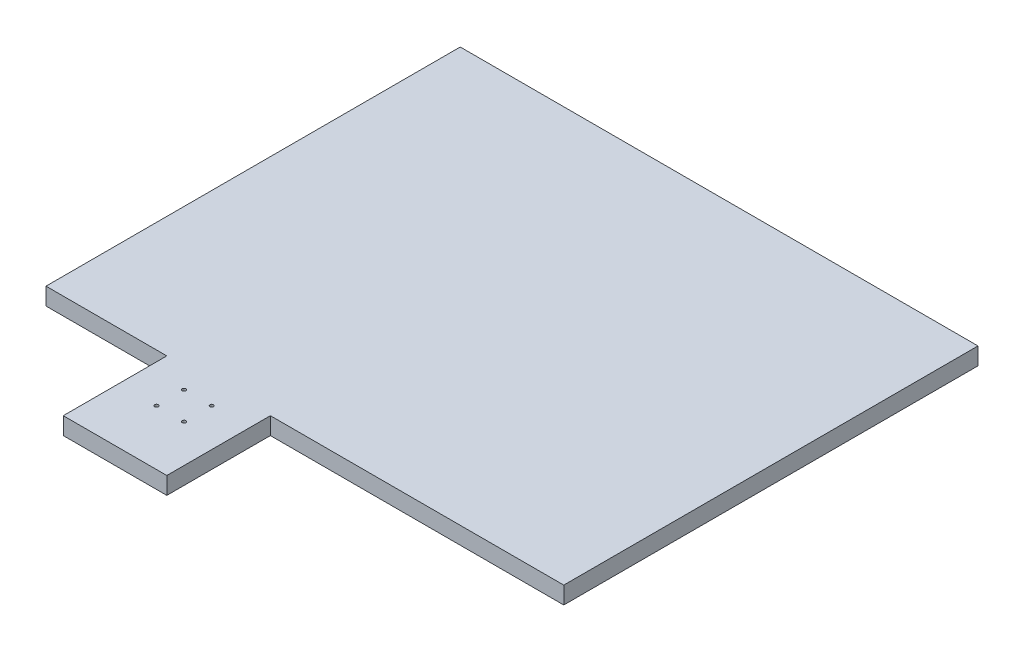
ISO-10303-21;
HEADER;
FILE_DESCRIPTION(('STEP AP214'),'2;1');
FILE_NAME('part.step','',(''),(''),'','','');
FILE_SCHEMA(('AUTOMOTIVE_DESIGN { 1 0 10303 214 1 1 1 1 }'));
ENDSEC;
DATA;
#1=APPLICATION_CONTEXT('core data for automotive mechanical design processes');
#2=APPLICATION_PROTOCOL_DEFINITION('international standard','automotive_design',2000,#1);
#3=PRODUCT_CONTEXT('',#1,'mechanical');
#4=PRODUCT('Part','Part','',(#3));
#5=PRODUCT_RELATED_PRODUCT_CATEGORY('part','',(#4));
#6=PRODUCT_DEFINITION_FORMATION('','',#4);
#7=PRODUCT_DEFINITION_CONTEXT('part definition',#1,'design');
#8=PRODUCT_DEFINITION('design','',#6,#7);
#9=PRODUCT_DEFINITION_SHAPE('','',#8);
#10=(LENGTH_UNIT() NAMED_UNIT(*) SI_UNIT(.MILLI.,.METRE.));
#11=(NAMED_UNIT(*) PLANE_ANGLE_UNIT() SI_UNIT($,.RADIAN.));
#12=(NAMED_UNIT(*) SI_UNIT($,.STERADIAN.) SOLID_ANGLE_UNIT());
#13=UNCERTAINTY_MEASURE_WITH_UNIT(LENGTH_MEASURE(1.E-05),#10,'distance_accuracy_value','');
#14=(GEOMETRIC_REPRESENTATION_CONTEXT(3) GLOBAL_UNCERTAINTY_ASSIGNED_CONTEXT((#13)) GLOBAL_UNIT_ASSIGNED_CONTEXT((#10,
#11,#12)) REPRESENTATION_CONTEXT('',''));
#15=CARTESIAN_POINT('',(0.,0.,0.));
#16=DIRECTION('',(0.,0.,1.));
#17=DIRECTION('',(1.,0.,0.));
#18=AXIS2_PLACEMENT_3D('',#15,#16,#17);
#19=CARTESIAN_POINT('',(0.,10.,0.));
#20=DIRECTION('',(0.,-1.,0.));
#21=DIRECTION('',(0.,0.,-1.));
#22=AXIS2_PLACEMENT_3D('',#19,#20,#21);
#23=PLANE('',#22);
#24=CARTESIAN_POINT('',(-58.,10.,132.));
#25=DIRECTION('',(0.,-1.,0.));
#26=DIRECTION('',(0.,0.,-1.));
#27=AXIS2_PLACEMENT_3D('',#24,#25,#26);
#28=CIRCLE('',#27,1.04999999999999);
#29=CARTESIAN_POINT('',(-58.,10.,130.95));
#30=VERTEX_POINT('',#29);
#31=EDGE_CURVE('E285',#30,#30,#28,.T.);
#32=ORIENTED_EDGE('',*,*,#31,.T.);
#33=EDGE_LOOP('',(#32));
#34=FACE_BOUND('',#33,.T.);
#35=CARTESIAN_POINT('',(-41.9999999999997,10.,132.));
#36=DIRECTION('',(0.,-1.,0.));
#37=DIRECTION('',(0.,0.,-1.));
#38=AXIS2_PLACEMENT_3D('',#35,#36,#37);
#39=CIRCLE('',#38,1.04999999999999);
#40=CARTESIAN_POINT('',(-41.9999999999997,10.,130.95));
#41=VERTEX_POINT('',#40);
#42=EDGE_CURVE('E281',#41,#41,#39,.F.);
#43=ORIENTED_EDGE('',*,*,#42,.F.);
#44=EDGE_LOOP('',(#43));
#45=FACE_BOUND('',#44,.T.);
#46=DIRECTION('',(0.,0.,-1.));
#47=VECTOR('',#46,1.);
#48=CARTESIAN_POINT('',(150.,10.,120.));
#49=LINE('',#48,#47);
#50=CARTESIAN_POINT('',(150.,10.,120.));
#51=VERTEX_POINT('',#50);
#52=CARTESIAN_POINT('',(150.,10.,-120.));
#53=VERTEX_POINT('',#52);
#54=EDGE_CURVE('E177',#51,#53,#49,.T.);
#55=ORIENTED_EDGE('',*,*,#54,.T.);
#56=DIRECTION('',(-1.,0.,0.));
#57=VECTOR('',#56,1.);
#58=CARTESIAN_POINT('',(-150.,10.,-120.));
#59=LINE('',#58,#57);
#60=CARTESIAN_POINT('',(-150.,10.,-120.));
#61=VERTEX_POINT('',#60);
#62=EDGE_CURVE('E105',#53,#61,#59,.T.);
#63=ORIENTED_EDGE('',*,*,#62,.T.);
#64=DIRECTION('',(0.,0.,1.));
#65=VECTOR('',#64,1.);
#66=CARTESIAN_POINT('',(-150.,10.,120.));
#67=LINE('',#66,#65);
#68=CARTESIAN_POINT('',(-150.,10.,120.));
#69=VERTEX_POINT('',#68);
#70=EDGE_CURVE('E198',#61,#69,#67,.T.);
#71=ORIENTED_EDGE('',*,*,#70,.T.);
#72=DIRECTION('',(1.,0.,0.));
#73=VECTOR('',#72,1.);
#74=CARTESIAN_POINT('',(-150.,10.,120.));
#75=LINE('',#74,#73);
#76=CARTESIAN_POINT('',(-80.,10.,120.));
#77=VERTEX_POINT('',#76);
#78=EDGE_CURVE('E212',#69,#77,#75,.T.);
#79=ORIENTED_EDGE('',*,*,#78,.T.);
#80=DIRECTION('',(0.,0.,1.));
#81=VECTOR('',#80,1.);
#82=CARTESIAN_POINT('',(-80.,10.,120.));
#83=LINE('',#82,#81);
#84=CARTESIAN_POINT('',(-80.,10.,180.));
#85=VERTEX_POINT('',#84);
#86=EDGE_CURVE('E128',#77,#85,#83,.T.);
#87=ORIENTED_EDGE('',*,*,#86,.T.);
#88=DIRECTION('',(1.,0.,0.));
#89=VECTOR('',#88,1.);
#90=CARTESIAN_POINT('',(-80.,10.,180.));
#91=LINE('',#90,#89);
#92=CARTESIAN_POINT('',(-20.,10.,180.));
#93=VERTEX_POINT('',#92);
#94=EDGE_CURVE('E121',#85,#93,#91,.T.);
#95=ORIENTED_EDGE('',*,*,#94,.T.);
#96=DIRECTION('',(0.,0.,-1.));
#97=VECTOR('',#96,1.);
#98=CARTESIAN_POINT('',(-20.,10.,180.));
#99=LINE('',#98,#97);
#100=CARTESIAN_POINT('',(-20.,10.,120.));
#101=VERTEX_POINT('',#100);
#102=EDGE_CURVE('E125',#93,#101,#99,.T.);
#103=ORIENTED_EDGE('',*,*,#102,.T.);
#104=DIRECTION('',(1.,0.,0.));
#105=VECTOR('',#104,1.);
#106=CARTESIAN_POINT('',(-20.,10.,120.));
#107=LINE('',#106,#105);
#108=EDGE_CURVE('E64',#101,#51,#107,.T.);
#109=ORIENTED_EDGE('',*,*,#108,.T.);
#110=EDGE_LOOP('',(#55,#63,#71,#79,#87,#95,#103,#109));
#111=FACE_BOUND('',#110,.T.);
#112=CARTESIAN_POINT('',(-58.,10.,148.));
#113=DIRECTION('',(0.,-1.,0.));
#114=DIRECTION('',(0.,0.,-1.));
#115=AXIS2_PLACEMENT_3D('',#112,#113,#114);
#116=CIRCLE('',#115,1.04999999999999);
#117=CARTESIAN_POINT('',(-58.,10.,146.95));
#118=VERTEX_POINT('',#117);
#119=EDGE_CURVE('E290',#118,#118,#116,.F.);
#120=ORIENTED_EDGE('',*,*,#119,.F.);
#121=EDGE_LOOP('',(#120));
#122=FACE_BOUND('',#121,.T.);
#123=CARTESIAN_POINT('',(-41.9999999999998,10.,148.));
#124=DIRECTION('',(0.,-1.,0.));
#125=DIRECTION('',(0.,0.,-1.));
#126=AXIS2_PLACEMENT_3D('',#123,#124,#125);
#127=CIRCLE('',#126,1.04999999999999);
#128=CARTESIAN_POINT('',(-41.9999999999998,10.,146.95));
#129=VERTEX_POINT('',#128);
#130=EDGE_CURVE('E286',#129,#129,#127,.T.);
#131=ORIENTED_EDGE('',*,*,#130,.T.);
#132=EDGE_LOOP('',(#131));
#133=FACE_BOUND('',#132,.T.);
#134=ADVANCED_FACE('F39',(#34,#45,#111,#122,#133),#23,.F.);
#135=CARTESIAN_POINT('',(0.,0.,0.));
#136=DIRECTION('',(0.,-1.,0.));
#137=DIRECTION('',(0.,0.,-1.));
#138=AXIS2_PLACEMENT_3D('',#135,#136,#137);
#139=PLANE('',#138);
#140=DIRECTION('',(0.,0.,-1.));
#141=VECTOR('',#140,1.);
#142=CARTESIAN_POINT('',(150.,0.,120.));
#143=LINE('',#142,#141);
#144=CARTESIAN_POINT('',(150.,0.,120.));
#145=VERTEX_POINT('',#144);
#146=CARTESIAN_POINT('',(150.,0.,-120.));
#147=VERTEX_POINT('',#146);
#148=EDGE_CURVE('E153',#145,#147,#143,.T.);
#149=ORIENTED_EDGE('',*,*,#148,.F.);
#150=DIRECTION('',(1.,0.,0.));
#151=VECTOR('',#150,1.);
#152=CARTESIAN_POINT('',(-20.,0.,120.));
#153=LINE('',#152,#151);
#154=CARTESIAN_POINT('',(-20.,0.,120.));
#155=VERTEX_POINT('',#154);
#156=EDGE_CURVE('E97',#155,#145,#153,.T.);
#157=ORIENTED_EDGE('',*,*,#156,.F.);
#158=DIRECTION('',(0.,0.,-1.));
#159=VECTOR('',#158,1.);
#160=CARTESIAN_POINT('',(-20.,0.,180.));
#161=LINE('',#160,#159);
#162=CARTESIAN_POINT('',(-20.,0.,180.));
#163=VERTEX_POINT('',#162);
#164=EDGE_CURVE('E172',#163,#155,#161,.T.);
#165=ORIENTED_EDGE('',*,*,#164,.F.);
#166=DIRECTION('',(1.,0.,0.));
#167=VECTOR('',#166,1.);
#168=CARTESIAN_POINT('',(-80.,0.,180.));
#169=LINE('',#168,#167);
#170=CARTESIAN_POINT('',(-80.,0.,180.));
#171=VERTEX_POINT('',#170);
#172=EDGE_CURVE('E138',#171,#163,#169,.T.);
#173=ORIENTED_EDGE('',*,*,#172,.F.);
#174=DIRECTION('',(0.,0.,1.));
#175=VECTOR('',#174,1.);
#176=CARTESIAN_POINT('',(-80.,0.,120.));
#177=LINE('',#176,#175);
#178=CARTESIAN_POINT('',(-80.,0.,120.));
#179=VERTEX_POINT('',#178);
#180=EDGE_CURVE('E167',#179,#171,#177,.T.);
#181=ORIENTED_EDGE('',*,*,#180,.F.);
#182=DIRECTION('',(1.,0.,0.));
#183=VECTOR('',#182,1.);
#184=CARTESIAN_POINT('',(-150.,0.,120.));
#185=LINE('',#184,#183);
#186=CARTESIAN_POINT('',(-150.,0.,120.));
#187=VERTEX_POINT('',#186);
#188=EDGE_CURVE('E164',#187,#179,#185,.T.);
#189=ORIENTED_EDGE('',*,*,#188,.F.);
#190=DIRECTION('',(0.,0.,1.));
#191=VECTOR('',#190,1.);
#192=CARTESIAN_POINT('',(-150.,0.,120.));
#193=LINE('',#192,#191);
#194=CARTESIAN_POINT('',(-150.,0.,-120.));
#195=VERTEX_POINT('',#194);
#196=EDGE_CURVE('E161',#195,#187,#193,.T.);
#197=ORIENTED_EDGE('',*,*,#196,.F.);
#198=DIRECTION('',(-1.,0.,0.));
#199=VECTOR('',#198,1.);
#200=CARTESIAN_POINT('',(-150.,0.,-120.));
#201=LINE('',#200,#199);
#202=EDGE_CURVE('E157',#147,#195,#201,.T.);
#203=ORIENTED_EDGE('',*,*,#202,.F.);
#204=EDGE_LOOP('',(#149,#157,#165,#173,#181,#189,#197,#203));
#205=FACE_BOUND('',#204,.T.);
#206=DIRECTION('',(-1.,0.,0.));
#207=VECTOR('',#206,1.);
#208=CARTESIAN_POINT('',(0.,0.,150.));
#209=LINE('',#208,#207);
#210=CARTESIAN_POINT('',(-40.,0.,150.));
#211=VERTEX_POINT('',#210);
#212=CARTESIAN_POINT('',(-60.,0.,150.));
#213=VERTEX_POINT('',#212);
#214=EDGE_CURVE('E55',#211,#213,#209,.T.);
#215=ORIENTED_EDGE('',*,*,#214,.F.);
#216=DIRECTION('',(0.,0.,-1.));
#217=VECTOR('',#216,1.);
#218=CARTESIAN_POINT('',(-40.,0.,0.));
#219=LINE('',#218,#217);
#220=CARTESIAN_POINT('',(-40.,0.,130.));
#221=VERTEX_POINT('',#220);
#222=EDGE_CURVE('E236',#211,#221,#219,.T.);
#223=ORIENTED_EDGE('',*,*,#222,.T.);
#224=DIRECTION('',(-1.,0.,0.));
#225=VECTOR('',#224,1.);
#226=CARTESIAN_POINT('',(0.,0.,130.));
#227=LINE('',#226,#225);
#228=CARTESIAN_POINT('',(-60.,0.,130.));
#229=VERTEX_POINT('',#228);
#230=EDGE_CURVE('E241',#221,#229,#227,.T.);
#231=ORIENTED_EDGE('',*,*,#230,.T.);
#232=DIRECTION('',(0.,0.,-1.));
#233=VECTOR('',#232,1.);
#234=CARTESIAN_POINT('',(-60.,0.,0.));
#235=LINE('',#234,#233);
#236=EDGE_CURVE('E245',#213,#229,#235,.T.);
#237=ORIENTED_EDGE('',*,*,#236,.F.);
#238=EDGE_LOOP('',(#215,#223,#231,#237));
#239=FACE_BOUND('',#238,.T.);
#240=ADVANCED_FACE('F202',(#205,#239),#139,.T.);
#241=CARTESIAN_POINT('',(150.,10.,120.));
#242=DIRECTION('',(-1.,0.,0.));
#243=DIRECTION('',(0.,0.,1.));
#244=AXIS2_PLACEMENT_3D('',#241,#242,#243);
#245=PLANE('',#244);
#246=ORIENTED_EDGE('',*,*,#148,.T.);
#247=DIRECTION('',(0.,-1.,0.));
#248=VECTOR('',#247,1.);
#249=CARTESIAN_POINT('',(150.,10.,-120.));
#250=LINE('',#249,#248);
#251=EDGE_CURVE('E11',#53,#147,#250,.T.);
#252=ORIENTED_EDGE('',*,*,#251,.F.);
#253=ORIENTED_EDGE('',*,*,#54,.F.);
#254=DIRECTION('',(0.,-1.,0.));
#255=VECTOR('',#254,1.);
#256=CARTESIAN_POINT('',(150.,10.,120.));
#257=LINE('',#256,#255);
#258=EDGE_CURVE('E149',#51,#145,#257,.T.);
#259=ORIENTED_EDGE('',*,*,#258,.T.);
#260=EDGE_LOOP('',(#246,#252,#253,#259));
#261=FACE_BOUND('',#260,.T.);
#262=ADVANCED_FACE('F41',(#261),#245,.F.);
#263=CARTESIAN_POINT('',(-150.,10.,-120.));
#264=DIRECTION('',(0.,0.,1.));
#265=DIRECTION('',(1.,0.,0.));
#266=AXIS2_PLACEMENT_3D('',#263,#264,#265);
#267=PLANE('',#266);
#268=ORIENTED_EDGE('',*,*,#202,.T.);
#269=DIRECTION('',(0.,-1.,0.));
#270=VECTOR('',#269,1.);
#271=CARTESIAN_POINT('',(-150.,10.,-120.));
#272=LINE('',#271,#270);
#273=EDGE_CURVE('E48',#61,#195,#272,.T.);
#274=ORIENTED_EDGE('',*,*,#273,.F.);
#275=ORIENTED_EDGE('',*,*,#62,.F.);
#276=ORIENTED_EDGE('',*,*,#251,.T.);
#277=EDGE_LOOP('',(#268,#274,#275,#276));
#278=FACE_BOUND('',#277,.T.);
#279=ADVANCED_FACE('F338',(#278),#267,.F.);
#280=CARTESIAN_POINT('',(-150.,10.,120.));
#281=DIRECTION('',(1.,0.,0.));
#282=DIRECTION('',(0.,0.,-1.));
#283=AXIS2_PLACEMENT_3D('',#280,#281,#282);
#284=PLANE('',#283);
#285=ORIENTED_EDGE('',*,*,#196,.T.);
#286=DIRECTION('',(0.,-1.,0.));
#287=VECTOR('',#286,1.);
#288=CARTESIAN_POINT('',(-150.,10.,120.));
#289=LINE('',#288,#287);
#290=EDGE_CURVE('E188',#69,#187,#289,.T.);
#291=ORIENTED_EDGE('',*,*,#290,.F.);
#292=ORIENTED_EDGE('',*,*,#70,.F.);
#293=ORIENTED_EDGE('',*,*,#273,.T.);
#294=EDGE_LOOP('',(#285,#291,#292,#293));
#295=FACE_BOUND('',#294,.T.);
#296=ADVANCED_FACE('F196',(#295),#284,.F.);
#297=CARTESIAN_POINT('',(-150.,10.,120.));
#298=DIRECTION('',(0.,0.,-1.));
#299=DIRECTION('',(-1.,0.,0.));
#300=AXIS2_PLACEMENT_3D('',#297,#298,#299);
#301=PLANE('',#300);
#302=ORIENTED_EDGE('',*,*,#188,.T.);
#303=DIRECTION('',(0.,-1.,0.));
#304=VECTOR('',#303,1.);
#305=CARTESIAN_POINT('',(-80.,10.,120.));
#306=LINE('',#305,#304);
#307=EDGE_CURVE('E184',#77,#179,#306,.T.);
#308=ORIENTED_EDGE('',*,*,#307,.F.);
#309=ORIENTED_EDGE('',*,*,#78,.F.);
#310=ORIENTED_EDGE('',*,*,#290,.T.);
#311=EDGE_LOOP('',(#302,#308,#309,#310));
#312=FACE_BOUND('',#311,.T.);
#313=ADVANCED_FACE('F207',(#312),#301,.F.);
#314=CARTESIAN_POINT('',(-80.,10.,120.));
#315=DIRECTION('',(1.,0.,0.));
#316=DIRECTION('',(0.,0.,-1.));
#317=AXIS2_PLACEMENT_3D('',#314,#315,#316);
#318=PLANE('',#317);
#319=ORIENTED_EDGE('',*,*,#180,.T.);
#320=DIRECTION('',(0.,-1.,0.));
#321=VECTOR('',#320,1.);
#322=CARTESIAN_POINT('',(-80.,10.,180.));
#323=LINE('',#322,#321);
#324=EDGE_CURVE('E142',#85,#171,#323,.T.);
#325=ORIENTED_EDGE('',*,*,#324,.F.);
#326=ORIENTED_EDGE('',*,*,#86,.F.);
#327=ORIENTED_EDGE('',*,*,#307,.T.);
#328=EDGE_LOOP('',(#319,#325,#326,#327));
#329=FACE_BOUND('',#328,.T.);
#330=ADVANCED_FACE('F210',(#329),#318,.F.);
#331=CARTESIAN_POINT('',(-80.,10.,180.));
#332=DIRECTION('',(0.,0.,-1.));
#333=DIRECTION('',(-1.,0.,0.));
#334=AXIS2_PLACEMENT_3D('',#331,#332,#333);
#335=PLANE('',#334);
#336=ORIENTED_EDGE('',*,*,#172,.T.);
#337=DIRECTION('',(0.,-1.,0.));
#338=VECTOR('',#337,1.);
#339=CARTESIAN_POINT('',(-20.,10.,180.));
#340=LINE('',#339,#338);
#341=EDGE_CURVE('E135',#93,#163,#340,.T.);
#342=ORIENTED_EDGE('',*,*,#341,.F.);
#343=ORIENTED_EDGE('',*,*,#94,.F.);
#344=ORIENTED_EDGE('',*,*,#324,.T.);
#345=EDGE_LOOP('',(#336,#342,#343,#344));
#346=FACE_BOUND('',#345,.T.);
#347=ADVANCED_FACE('F136',(#346),#335,.F.);
#348=CARTESIAN_POINT('',(-20.,10.,180.));
#349=DIRECTION('',(-1.,0.,0.));
#350=DIRECTION('',(0.,0.,1.));
#351=AXIS2_PLACEMENT_3D('',#348,#349,#350);
#352=PLANE('',#351);
#353=ORIENTED_EDGE('',*,*,#164,.T.);
#354=DIRECTION('',(0.,-1.,0.));
#355=VECTOR('',#354,1.);
#356=CARTESIAN_POINT('',(-20.,10.,120.));
#357=LINE('',#356,#355);
#358=EDGE_CURVE('E143',#101,#155,#357,.T.);
#359=ORIENTED_EDGE('',*,*,#358,.F.);
#360=ORIENTED_EDGE('',*,*,#102,.F.);
#361=ORIENTED_EDGE('',*,*,#341,.T.);
#362=EDGE_LOOP('',(#353,#359,#360,#361));
#363=FACE_BOUND('',#362,.T.);
#364=ADVANCED_FACE('F145',(#363),#352,.F.);
#365=CARTESIAN_POINT('',(-20.,10.,120.));
#366=DIRECTION('',(0.,0.,-1.));
#367=DIRECTION('',(-1.,0.,0.));
#368=AXIS2_PLACEMENT_3D('',#365,#366,#367);
#369=PLANE('',#368);
#370=ORIENTED_EDGE('',*,*,#156,.T.);
#371=ORIENTED_EDGE('',*,*,#258,.F.);
#372=ORIENTED_EDGE('',*,*,#108,.F.);
#373=ORIENTED_EDGE('',*,*,#358,.T.);
#374=EDGE_LOOP('',(#370,#371,#372,#373));
#375=FACE_BOUND('',#374,.T.);
#376=ADVANCED_FACE('F326',(#375),#369,.F.);
#377=CARTESIAN_POINT('',(0.,8.,150.));
#378=DIRECTION('',(0.,0.,1.));
#379=DIRECTION('',(1.,0.,0.));
#380=AXIS2_PLACEMENT_3D('',#377,#378,#379);
#381=PLANE('',#380);
#382=ORIENTED_EDGE('',*,*,#214,.T.);
#383=DIRECTION('',(0.,-1.,0.));
#384=VECTOR('',#383,1.);
#385=CARTESIAN_POINT('',(-60.,8.,150.));
#386=LINE('',#385,#384);
#387=CARTESIAN_POINT('',(-60.,8.,150.));
#388=VERTEX_POINT('',#387);
#389=EDGE_CURVE('E222',#388,#213,#386,.T.);
#390=ORIENTED_EDGE('',*,*,#389,.F.);
#391=DIRECTION('',(-1.,0.,0.));
#392=VECTOR('',#391,1.);
#393=CARTESIAN_POINT('',(0.,8.,150.));
#394=LINE('',#393,#392);
#395=CARTESIAN_POINT('',(-40.,8.,150.));
#396=VERTEX_POINT('',#395);
#397=EDGE_CURVE('E240',#396,#388,#394,.T.);
#398=ORIENTED_EDGE('',*,*,#397,.F.);
#399=DIRECTION('',(0.,-1.,0.));
#400=VECTOR('',#399,1.);
#401=CARTESIAN_POINT('',(-40.,8.,150.));
#402=LINE('',#401,#400);
#403=EDGE_CURVE('E158',#396,#211,#402,.T.);
#404=ORIENTED_EDGE('',*,*,#403,.T.);
#405=EDGE_LOOP('',(#382,#390,#398,#404));
#406=FACE_BOUND('',#405,.T.);
#407=ADVANCED_FACE('F323',(#406),#381,.F.);
#408=CARTESIAN_POINT('',(-40.,8.,0.));
#409=DIRECTION('',(-1.,0.,0.));
#410=DIRECTION('',(0.,0.,1.));
#411=AXIS2_PLACEMENT_3D('',#408,#409,#410);
#412=PLANE('',#411);
#413=ORIENTED_EDGE('',*,*,#222,.F.);
#414=ORIENTED_EDGE('',*,*,#403,.F.);
#415=DIRECTION('',(0.,0.,-1.));
#416=VECTOR('',#415,1.);
#417=CARTESIAN_POINT('',(-40.,8.,0.));
#418=LINE('',#417,#416);
#419=CARTESIAN_POINT('',(-40.,8.,130.));
#420=VERTEX_POINT('',#419);
#421=EDGE_CURVE('E226',#396,#420,#418,.T.);
#422=ORIENTED_EDGE('',*,*,#421,.T.);
#423=DIRECTION('',(0.,-1.,0.));
#424=VECTOR('',#423,1.);
#425=CARTESIAN_POINT('',(-40.,8.,130.));
#426=LINE('',#425,#424);
#427=EDGE_CURVE('E230',#420,#221,#426,.T.);
#428=ORIENTED_EDGE('',*,*,#427,.T.);
#429=EDGE_LOOP('',(#413,#414,#422,#428));
#430=FACE_BOUND('',#429,.T.);
#431=ADVANCED_FACE('F365',(#430),#412,.T.);
#432=CARTESIAN_POINT('',(0.,8.,130.));
#433=DIRECTION('',(0.,0.,1.));
#434=DIRECTION('',(1.,0.,0.));
#435=AXIS2_PLACEMENT_3D('',#432,#433,#434);
#436=PLANE('',#435);
#437=ORIENTED_EDGE('',*,*,#230,.F.);
#438=ORIENTED_EDGE('',*,*,#427,.F.);
#439=DIRECTION('',(-1.,0.,0.));
#440=VECTOR('',#439,1.);
#441=CARTESIAN_POINT('',(0.,8.,130.));
#442=LINE('',#441,#440);
#443=CARTESIAN_POINT('',(-60.,8.,130.));
#444=VERTEX_POINT('',#443);
#445=EDGE_CURVE('E255',#420,#444,#442,.T.);
#446=ORIENTED_EDGE('',*,*,#445,.T.);
#447=DIRECTION('',(0.,-1.,0.));
#448=VECTOR('',#447,1.);
#449=CARTESIAN_POINT('',(-60.,8.,130.));
#450=LINE('',#449,#448);
#451=EDGE_CURVE('E225',#444,#229,#450,.T.);
#452=ORIENTED_EDGE('',*,*,#451,.T.);
#453=EDGE_LOOP('',(#437,#438,#446,#452));
#454=FACE_BOUND('',#453,.T.);
#455=ADVANCED_FACE('F373',(#454),#436,.T.);
#456=CARTESIAN_POINT('',(-60.,8.,0.));
#457=DIRECTION('',(-1.,0.,0.));
#458=DIRECTION('',(0.,0.,1.));
#459=AXIS2_PLACEMENT_3D('',#456,#457,#458);
#460=PLANE('',#459);
#461=ORIENTED_EDGE('',*,*,#236,.T.);
#462=ORIENTED_EDGE('',*,*,#451,.F.);
#463=DIRECTION('',(0.,0.,-1.));
#464=VECTOR('',#463,1.);
#465=CARTESIAN_POINT('',(-60.,8.,0.));
#466=LINE('',#465,#464);
#467=EDGE_CURVE('E259',#388,#444,#466,.T.);
#468=ORIENTED_EDGE('',*,*,#467,.F.);
#469=ORIENTED_EDGE('',*,*,#389,.T.);
#470=EDGE_LOOP('',(#461,#462,#468,#469));
#471=FACE_BOUND('',#470,.T.);
#472=ADVANCED_FACE('F383',(#471),#460,.F.);
#473=CARTESIAN_POINT('',(0.,8.,0.));
#474=DIRECTION('',(0.,-1.,0.));
#475=DIRECTION('',(0.,0.,-1.));
#476=AXIS2_PLACEMENT_3D('',#473,#474,#475);
#477=PLANE('',#476);
#478=CARTESIAN_POINT('',(-58.,8.,148.));
#479=DIRECTION('',(0.,-1.,0.));
#480=DIRECTION('',(0.,0.,-1.));
#481=AXIS2_PLACEMENT_3D('',#478,#479,#480);
#482=CIRCLE('',#481,1.04999999999999);
#483=CARTESIAN_POINT('',(-58.,8.,146.95));
#484=VERTEX_POINT('',#483);
#485=EDGE_CURVE('E251',#484,#484,#482,.F.);
#486=ORIENTED_EDGE('',*,*,#485,.T.);
#487=EDGE_LOOP('',(#486));
#488=FACE_BOUND('',#487,.T.);
#489=CARTESIAN_POINT('',(-58.,8.,132.));
#490=DIRECTION('',(0.,-1.,0.));
#491=DIRECTION('',(0.,0.,-1.));
#492=AXIS2_PLACEMENT_3D('',#489,#490,#491);
#493=CIRCLE('',#492,1.04999999999999);
#494=CARTESIAN_POINT('',(-58.,8.,130.95));
#495=VERTEX_POINT('',#494);
#496=EDGE_CURVE('E269',#495,#495,#493,.T.);
#497=ORIENTED_EDGE('',*,*,#496,.F.);
#498=EDGE_LOOP('',(#497));
#499=FACE_BOUND('',#498,.T.);
#500=ORIENTED_EDGE('',*,*,#397,.T.);
#501=ORIENTED_EDGE('',*,*,#467,.T.);
#502=ORIENTED_EDGE('',*,*,#445,.F.);
#503=ORIENTED_EDGE('',*,*,#421,.F.);
#504=EDGE_LOOP('',(#500,#501,#502,#503));
#505=FACE_BOUND('',#504,.T.);
#506=CARTESIAN_POINT('',(-41.9999999999998,8.,148.));
#507=DIRECTION('',(0.,-1.,0.));
#508=DIRECTION('',(0.,0.,-1.));
#509=AXIS2_PLACEMENT_3D('',#506,#507,#508);
#510=CIRCLE('',#509,1.04999999999999);
#511=CARTESIAN_POINT('',(-41.9999999999998,8.,146.95));
#512=VERTEX_POINT('',#511);
#513=EDGE_CURVE('E273',#512,#512,#510,.T.);
#514=ORIENTED_EDGE('',*,*,#513,.F.);
#515=EDGE_LOOP('',(#514));
#516=FACE_BOUND('',#515,.T.);
#517=CARTESIAN_POINT('',(-41.9999999999997,8.,132.));
#518=DIRECTION('',(0.,-1.,0.));
#519=DIRECTION('',(0.,0.,-1.));
#520=AXIS2_PLACEMENT_3D('',#517,#518,#519);
#521=CIRCLE('',#520,1.04999999999999);
#522=CARTESIAN_POINT('',(-41.9999999999997,8.,130.95));
#523=VERTEX_POINT('',#522);
#524=EDGE_CURVE('E277',#523,#523,#521,.F.);
#525=ORIENTED_EDGE('',*,*,#524,.T.);
#526=EDGE_LOOP('',(#525));
#527=FACE_BOUND('',#526,.T.);
#528=ADVANCED_FACE('F313',(#488,#499,#505,#516,#527),#477,.T.);
#529=CARTESIAN_POINT('',(-41.9999999999997,10.,132.));
#530=DIRECTION('',(0.,-1.,0.));
#531=DIRECTION('',(0.,0.,-1.));
#532=AXIS2_PLACEMENT_3D('',#529,#530,#531);
#533=CYLINDRICAL_SURFACE('',#532,1.04999999999999);
#534=ORIENTED_EDGE('',*,*,#524,.F.);
#535=EDGE_LOOP('',(#534));
#536=FACE_BOUND('',#535,.T.);
#537=ORIENTED_EDGE('',*,*,#42,.T.);
#538=EDGE_LOOP('',(#537));
#539=FACE_BOUND('',#538,.T.);
#540=ADVANCED_FACE('F303',(#536,#539),#533,.F.);
#541=CARTESIAN_POINT('',(-58.,10.,132.));
#542=DIRECTION('',(0.,-1.,0.));
#543=DIRECTION('',(0.,0.,-1.));
#544=AXIS2_PLACEMENT_3D('',#541,#542,#543);
#545=CYLINDRICAL_SURFACE('',#544,1.04999999999999);
#546=ORIENTED_EDGE('',*,*,#496,.T.);
#547=EDGE_LOOP('',(#546));
#548=FACE_BOUND('',#547,.T.);
#549=ORIENTED_EDGE('',*,*,#31,.F.);
#550=EDGE_LOOP('',(#549));
#551=FACE_BOUND('',#550,.T.);
#552=ADVANCED_FACE('F300',(#548,#551),#545,.F.);
#553=CARTESIAN_POINT('',(-58.,10.,148.));
#554=DIRECTION('',(0.,-1.,0.));
#555=DIRECTION('',(0.,0.,-1.));
#556=AXIS2_PLACEMENT_3D('',#553,#554,#555);
#557=CYLINDRICAL_SURFACE('',#556,1.04999999999999);
#558=ORIENTED_EDGE('',*,*,#485,.F.);
#559=EDGE_LOOP('',(#558));
#560=FACE_BOUND('',#559,.T.);
#561=ORIENTED_EDGE('',*,*,#119,.T.);
#562=EDGE_LOOP('',(#561));
#563=FACE_BOUND('',#562,.T.);
#564=ADVANCED_FACE('F302',(#560,#563),#557,.F.);
#565=CARTESIAN_POINT('',(-41.9999999999998,10.,148.));
#566=DIRECTION('',(0.,-1.,0.));
#567=DIRECTION('',(0.,0.,-1.));
#568=AXIS2_PLACEMENT_3D('',#565,#566,#567);
#569=CYLINDRICAL_SURFACE('',#568,1.04999999999999);
#570=ORIENTED_EDGE('',*,*,#513,.T.);
#571=EDGE_LOOP('',(#570));
#572=FACE_BOUND('',#571,.T.);
#573=ORIENTED_EDGE('',*,*,#130,.F.);
#574=EDGE_LOOP('',(#573));
#575=FACE_BOUND('',#574,.T.);
#576=ADVANCED_FACE('F310',(#572,#575),#569,.F.);
#577=CLOSED_SHELL('',(#134,#240,#262,#279,#296,#313,#330,#347,#364,#376,#407,#431,#455,#472,
#528,#540,#552,#564,#576));
#578=MANIFOLD_SOLID_BREP('B2',#577);
#579=ADVANCED_BREP_SHAPE_REPRESENTATION('',(#18,#578),#14);
#580=SHAPE_DEFINITION_REPRESENTATION(#9,#579);
ENDSEC;
END-ISO-10303-21;
